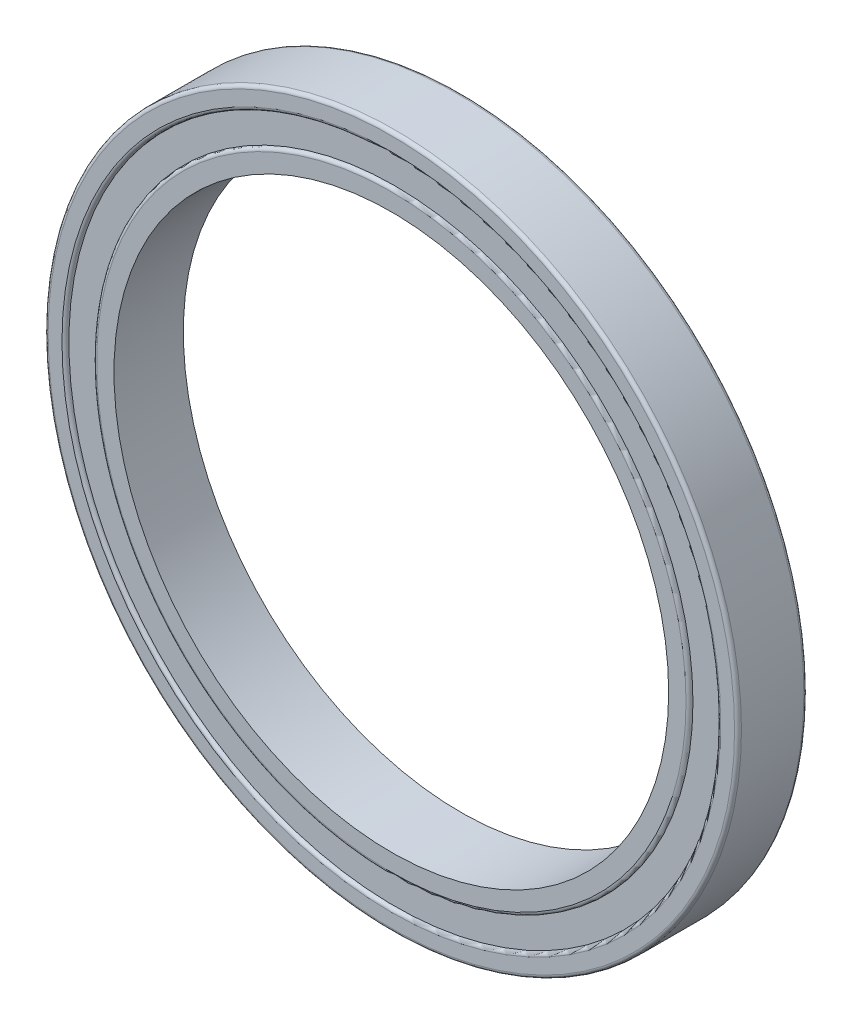
ISO-10303-21;
HEADER;
FILE_DESCRIPTION(('STEP AP214'),'2;1');
FILE_NAME('part.step','',(''),(''),'','','');
FILE_SCHEMA(('AUTOMOTIVE_DESIGN { 1 0 10303 214 1 1 1 1 }'));
ENDSEC;
DATA;
#1=APPLICATION_CONTEXT('core data for automotive mechanical design processes');
#2=APPLICATION_PROTOCOL_DEFINITION('international standard','automotive_design',2000,#1);
#3=PRODUCT_CONTEXT('',#1,'mechanical');
#4=PRODUCT('Part','Part','',(#3));
#5=PRODUCT_RELATED_PRODUCT_CATEGORY('part','',(#4));
#6=PRODUCT_DEFINITION_FORMATION('','',#4);
#7=PRODUCT_DEFINITION_CONTEXT('part definition',#1,'design');
#8=PRODUCT_DEFINITION('design','',#6,#7);
#9=PRODUCT_DEFINITION_SHAPE('','',#8);
#10=(LENGTH_UNIT() NAMED_UNIT(*) SI_UNIT(.MILLI.,.METRE.));
#11=(NAMED_UNIT(*) PLANE_ANGLE_UNIT() SI_UNIT($,.RADIAN.));
#12=(NAMED_UNIT(*) SI_UNIT($,.STERADIAN.) SOLID_ANGLE_UNIT());
#13=UNCERTAINTY_MEASURE_WITH_UNIT(LENGTH_MEASURE(1.E-05),#10,'distance_accuracy_value','');
#14=(GEOMETRIC_REPRESENTATION_CONTEXT(3) GLOBAL_UNCERTAINTY_ASSIGNED_CONTEXT((#13)) GLOBAL_UNIT_ASSIGNED_CONTEXT((#10,
#11,#12)) REPRESENTATION_CONTEXT('',''));
#15=CARTESIAN_POINT('',(0.,0.,0.));
#16=DIRECTION('',(0.,0.,1.));
#17=DIRECTION('',(1.,0.,0.));
#18=AXIS2_PLACEMENT_3D('',#15,#16,#17);
#19=CARTESIAN_POINT('',(0.,0.,0.));
#20=DIRECTION('',(0.,0.,1.));
#21=DIRECTION('',(1.,0.,0.));
#22=AXIS2_PLACEMENT_3D('',#19,#20,#21);
#23=PLANE('',#22);
#24=CARTESIAN_POINT('',(0.,0.,0.));
#25=DIRECTION('',(0.,0.,1.));
#26=DIRECTION('',(1.,0.,0.));
#27=AXIS2_PLACEMENT_3D('',#24,#25,#26);
#28=CIRCLE('',#27,42.5);
#29=CARTESIAN_POINT('',(42.5,0.,0.));
#30=VERTEX_POINT('',#29);
#31=EDGE_CURVE('E70',#30,#30,#28,.F.);
#32=ORIENTED_EDGE('',*,*,#31,.T.);
#33=EDGE_LOOP('',(#32));
#34=FACE_BOUND('',#33,.T.);
#35=CARTESIAN_POINT('',(0.,0.,0.));
#36=DIRECTION('',(0.,0.,1.));
#37=DIRECTION('',(1.,0.,0.));
#38=AXIS2_PLACEMENT_3D('',#35,#36,#37);
#39=CIRCLE('',#38,40.);
#40=CARTESIAN_POINT('',(40.,0.,0.));
#41=VERTEX_POINT('',#40);
#42=EDGE_CURVE('E74',#41,#41,#39,.T.);
#43=ORIENTED_EDGE('',*,*,#42,.T.);
#44=EDGE_LOOP('',(#43));
#45=FACE_BOUND('',#44,.T.);
#46=ADVANCED_FACE('F41',(#34,#45),#23,.F.);
#47=CARTESIAN_POINT('',(0.,0.,10.));
#48=DIRECTION('',(0.,0.,1.));
#49=DIRECTION('',(1.,0.,0.));
#50=AXIS2_PLACEMENT_3D('',#47,#48,#49);
#51=PLANE('',#50);
#52=CARTESIAN_POINT('',(0.,0.,10.));
#53=DIRECTION('',(0.,0.,1.));
#54=DIRECTION('',(1.,0.,0.));
#55=AXIS2_PLACEMENT_3D('',#52,#53,#54);
#56=CIRCLE('',#55,42.5);
#57=CARTESIAN_POINT('',(42.5,0.,10.));
#58=VERTEX_POINT('',#57);
#59=EDGE_CURVE('E61',#58,#58,#56,.T.);
#60=ORIENTED_EDGE('',*,*,#59,.T.);
#61=EDGE_LOOP('',(#60));
#62=FACE_BOUND('',#61,.T.);
#63=CARTESIAN_POINT('',(0.,0.,10.));
#64=DIRECTION('',(0.,0.,1.));
#65=DIRECTION('',(1.,0.,0.));
#66=AXIS2_PLACEMENT_3D('',#63,#64,#65);
#67=CIRCLE('',#66,40.);
#68=CARTESIAN_POINT('',(40.,0.,10.));
#69=VERTEX_POINT('',#68);
#70=EDGE_CURVE('E73',#69,#69,#67,.T.);
#71=ORIENTED_EDGE('',*,*,#70,.F.);
#72=EDGE_LOOP('',(#71));
#73=FACE_BOUND('',#72,.T.);
#74=ADVANCED_FACE('F117',(#62,#73),#51,.T.);
#75=CARTESIAN_POINT('',(0.,0.,10.));
#76=DIRECTION('',(0.,0.,1.));
#77=DIRECTION('',(1.,0.,0.));
#78=AXIS2_PLACEMENT_3D('',#75,#76,#77);
#79=CIRCLE('',#78,47.5);
#80=CARTESIAN_POINT('',(47.5,0.,10.));
#81=VERTEX_POINT('',#80);
#82=EDGE_CURVE('E52',#81,#81,#79,.F.);
#83=ORIENTED_EDGE('',*,*,#82,.T.);
#84=EDGE_LOOP('',(#83));
#85=FACE_BOUND('',#84,.T.);
#86=CARTESIAN_POINT('',(0.,0.,10.));
#87=DIRECTION('',(0.,0.,1.));
#88=DIRECTION('',(1.,0.,0.));
#89=AXIS2_PLACEMENT_3D('',#86,#87,#88);
#90=CIRCLE('',#89,49.5);
#91=CARTESIAN_POINT('',(49.5,0.,10.));
#92=VERTEX_POINT('',#91);
#93=EDGE_CURVE('E56',#92,#92,#90,.T.);
#94=ORIENTED_EDGE('',*,*,#93,.T.);
#95=EDGE_LOOP('',(#94));
#96=FACE_BOUND('',#95,.T.);
#97=ADVANCED_FACE('F124',(#85,#96),#51,.T.);
#98=CARTESIAN_POINT('',(0.,0.,0.));
#99=DIRECTION('',(0.,0.,1.));
#100=DIRECTION('',(1.,0.,0.));
#101=AXIS2_PLACEMENT_3D('',#98,#99,#100);
#102=CIRCLE('',#101,47.5);
#103=CARTESIAN_POINT('',(47.5,0.,0.));
#104=VERTEX_POINT('',#103);
#105=EDGE_CURVE('E64',#104,#104,#102,.T.);
#106=ORIENTED_EDGE('',*,*,#105,.T.);
#107=EDGE_LOOP('',(#106));
#108=FACE_BOUND('',#107,.T.);
#109=CARTESIAN_POINT('',(0.,0.,0.));
#110=DIRECTION('',(0.,0.,1.));
#111=DIRECTION('',(1.,0.,0.));
#112=AXIS2_PLACEMENT_3D('',#109,#110,#111);
#113=CIRCLE('',#112,49.5);
#114=CARTESIAN_POINT('',(49.5,0.,0.));
#115=VERTEX_POINT('',#114);
#116=EDGE_CURVE('E67',#115,#115,#113,.F.);
#117=ORIENTED_EDGE('',*,*,#116,.T.);
#118=EDGE_LOOP('',(#117));
#119=FACE_BOUND('',#118,.T.);
#120=ADVANCED_FACE('F120',(#108,#119),#23,.F.);
#121=CARTESIAN_POINT('',(0.,0.,10.));
#122=DIRECTION('',(0.,0.,-1.));
#123=DIRECTION('',(-1.,0.,0.));
#124=AXIS2_PLACEMENT_3D('',#121,#122,#123);
#125=CYLINDRICAL_SURFACE('',#124,50.);
#126=CARTESIAN_POINT('',(0.,0.,0.5));
#127=DIRECTION('',(0.,0.,1.));
#128=DIRECTION('',(1.,0.,0.));
#129=AXIS2_PLACEMENT_3D('',#126,#127,#128);
#130=CIRCLE('',#129,50.);
#131=CARTESIAN_POINT('',(50.,0.,0.5));
#132=VERTEX_POINT('',#131);
#133=EDGE_CURVE('E10',#132,#132,#130,.T.);
#134=ORIENTED_EDGE('',*,*,#133,.T.);
#135=EDGE_LOOP('',(#134));
#136=FACE_BOUND('',#135,.T.);
#137=CARTESIAN_POINT('',(0.,0.,9.5));
#138=DIRECTION('',(0.,0.,1.));
#139=DIRECTION('',(1.,0.,0.));
#140=AXIS2_PLACEMENT_3D('',#137,#138,#139);
#141=CIRCLE('',#140,50.);
#142=CARTESIAN_POINT('',(50.,0.,9.5));
#143=VERTEX_POINT('',#142);
#144=EDGE_CURVE('E48',#143,#143,#141,.F.);
#145=ORIENTED_EDGE('',*,*,#144,.T.);
#146=EDGE_LOOP('',(#145));
#147=FACE_BOUND('',#146,.T.);
#148=ADVANCED_FACE('F130',(#136,#147),#125,.T.);
#149=CARTESIAN_POINT('',(0.,0.,10.));
#150=DIRECTION('',(0.,0.,-1.));
#151=DIRECTION('',(-1.,0.,0.));
#152=AXIS2_PLACEMENT_3D('',#149,#150,#151);
#153=CYLINDRICAL_SURFACE('',#152,40.);
#154=ORIENTED_EDGE('',*,*,#70,.T.);
#155=EDGE_LOOP('',(#154));
#156=FACE_BOUND('',#155,.T.);
#157=ORIENTED_EDGE('',*,*,#42,.F.);
#158=EDGE_LOOP('',(#157));
#159=FACE_BOUND('',#158,.T.);
#160=ADVANCED_FACE('F136',(#156,#159),#153,.F.);
#161=CARTESIAN_POINT('',(0.,0.,9.5));
#162=DIRECTION('',(0.,0.,1.));
#163=DIRECTION('',(1.,0.,0.));
#164=AXIS2_PLACEMENT_3D('',#161,#162,#163);
#165=PLANE('',#164);
#166=CARTESIAN_POINT('',(0.,0.,9.5));
#167=DIRECTION('',(0.,0.,1.));
#168=DIRECTION('',(1.,0.,0.));
#169=AXIS2_PLACEMENT_3D('',#166,#167,#168);
#170=CIRCLE('',#169,43.);
#171=CARTESIAN_POINT('',(43.,0.,9.5));
#172=VERTEX_POINT('',#171);
#173=EDGE_CURVE('E82',#172,#172,#170,.T.);
#174=ORIENTED_EDGE('',*,*,#173,.F.);
#175=EDGE_LOOP('',(#174));
#176=FACE_BOUND('',#175,.T.);
#177=CARTESIAN_POINT('',(0.,0.,9.5));
#178=DIRECTION('',(0.,0.,1.));
#179=DIRECTION('',(1.,0.,0.));
#180=AXIS2_PLACEMENT_3D('',#177,#178,#179);
#181=CIRCLE('',#180,47.);
#182=CARTESIAN_POINT('',(47.,0.,9.5));
#183=VERTEX_POINT('',#182);
#184=EDGE_CURVE('E77',#183,#183,#181,.T.);
#185=ORIENTED_EDGE('',*,*,#184,.T.);
#186=EDGE_LOOP('',(#185));
#187=FACE_BOUND('',#186,.T.);
#188=ADVANCED_FACE('F98',(#176,#187),#165,.T.);
#189=CARTESIAN_POINT('',(0.,0.,0.5));
#190=DIRECTION('',(0.,0.,-1.));
#191=DIRECTION('',(-1.,0.,0.));
#192=AXIS2_PLACEMENT_3D('',#189,#190,#191);
#193=PLANE('',#192);
#194=CARTESIAN_POINT('',(0.,0.,0.5));
#195=DIRECTION('',(0.,0.,-1.));
#196=DIRECTION('',(-1.,0.,0.));
#197=AXIS2_PLACEMENT_3D('',#194,#195,#196);
#198=CIRCLE('',#197,43.);
#199=CARTESIAN_POINT('',(-43.,0.,0.5));
#200=VERTEX_POINT('',#199);
#201=EDGE_CURVE('E88',#200,#200,#198,.T.);
#202=ORIENTED_EDGE('',*,*,#201,.F.);
#203=EDGE_LOOP('',(#202));
#204=FACE_BOUND('',#203,.T.);
#205=CARTESIAN_POINT('',(0.,0.,0.5));
#206=DIRECTION('',(0.,0.,-1.));
#207=DIRECTION('',(-1.,0.,0.));
#208=AXIS2_PLACEMENT_3D('',#205,#206,#207);
#209=CIRCLE('',#208,47.);
#210=CARTESIAN_POINT('',(-47.,0.,0.5));
#211=VERTEX_POINT('',#210);
#212=EDGE_CURVE('E85',#211,#211,#209,.T.);
#213=ORIENTED_EDGE('',*,*,#212,.T.);
#214=EDGE_LOOP('',(#213));
#215=FACE_BOUND('',#214,.T.);
#216=ADVANCED_FACE('F95',(#204,#215),#193,.T.);
#217=CARTESIAN_POINT('',(0.,0.,0.5));
#218=DIRECTION('',(0.,0.,1.));
#219=DIRECTION('',(1.,0.,0.));
#220=AXIS2_PLACEMENT_3D('',#217,#218,#219);
#221=TOROIDAL_SURFACE('',#220,42.5,0.5);
#222=ORIENTED_EDGE('',*,*,#201,.T.);
#223=EDGE_LOOP('',(#222));
#224=FACE_BOUND('',#223,.T.);
#225=ORIENTED_EDGE('',*,*,#31,.F.);
#226=EDGE_LOOP('',(#225));
#227=FACE_BOUND('',#226,.T.);
#228=ADVANCED_FACE('F92',(#224,#227),#221,.T.);
#229=CARTESIAN_POINT('',(0.,0.,0.5));
#230=DIRECTION('',(0.,0.,1.));
#231=DIRECTION('',(1.,0.,0.));
#232=AXIS2_PLACEMENT_3D('',#229,#230,#231);
#233=TOROIDAL_SURFACE('',#232,47.5,0.5);
#234=ORIENTED_EDGE('',*,*,#105,.F.);
#235=EDGE_LOOP('',(#234));
#236=FACE_BOUND('',#235,.T.);
#237=ORIENTED_EDGE('',*,*,#212,.F.);
#238=EDGE_LOOP('',(#237));
#239=FACE_BOUND('',#238,.T.);
#240=ADVANCED_FACE('F102',(#236,#239),#233,.T.);
#241=CARTESIAN_POINT('',(0.,0.,9.5));
#242=DIRECTION('',(0.,0.,1.));
#243=DIRECTION('',(1.,0.,0.));
#244=AXIS2_PLACEMENT_3D('',#241,#242,#243);
#245=TOROIDAL_SURFACE('',#244,42.5,0.5);
#246=ORIENTED_EDGE('',*,*,#173,.T.);
#247=EDGE_LOOP('',(#246));
#248=FACE_BOUND('',#247,.T.);
#249=ORIENTED_EDGE('',*,*,#59,.F.);
#250=EDGE_LOOP('',(#249));
#251=FACE_BOUND('',#250,.T.);
#252=ADVANCED_FACE('F104',(#248,#251),#245,.T.);
#253=CARTESIAN_POINT('',(0.,0.,9.5));
#254=DIRECTION('',(0.,0.,1.));
#255=DIRECTION('',(1.,0.,0.));
#256=AXIS2_PLACEMENT_3D('',#253,#254,#255);
#257=TOROIDAL_SURFACE('',#256,47.5,0.5);
#258=ORIENTED_EDGE('',*,*,#82,.F.);
#259=EDGE_LOOP('',(#258));
#260=FACE_BOUND('',#259,.T.);
#261=ORIENTED_EDGE('',*,*,#184,.F.);
#262=EDGE_LOOP('',(#261));
#263=FACE_BOUND('',#262,.T.);
#264=ADVANCED_FACE('F111',(#260,#263),#257,.T.);
#265=CARTESIAN_POINT('',(0.,0.,0.5));
#266=DIRECTION('',(0.,0.,1.));
#267=DIRECTION('',(1.,0.,0.));
#268=AXIS2_PLACEMENT_3D('',#265,#266,#267);
#269=TOROIDAL_SURFACE('',#268,49.5,0.5);
#270=ORIENTED_EDGE('',*,*,#116,.F.);
#271=EDGE_LOOP('',(#270));
#272=FACE_BOUND('',#271,.T.);
#273=ORIENTED_EDGE('',*,*,#133,.F.);
#274=EDGE_LOOP('',(#273));
#275=FACE_BOUND('',#274,.T.);
#276=ADVANCED_FACE('F141',(#272,#275),#269,.T.);
#277=CARTESIAN_POINT('',(0.,0.,9.5));
#278=DIRECTION('',(0.,0.,1.));
#279=DIRECTION('',(1.,0.,0.));
#280=AXIS2_PLACEMENT_3D('',#277,#278,#279);
#281=TOROIDAL_SURFACE('',#280,49.5,0.5);
#282=ORIENTED_EDGE('',*,*,#144,.F.);
#283=EDGE_LOOP('',(#282));
#284=FACE_BOUND('',#283,.T.);
#285=ORIENTED_EDGE('',*,*,#93,.F.);
#286=EDGE_LOOP('',(#285));
#287=FACE_BOUND('',#286,.T.);
#288=ADVANCED_FACE('F43',(#284,#287),#281,.T.);
#289=CLOSED_SHELL('',(#46,#74,#97,#120,#148,#160,#188,#216,#228,#240,#252,#264,#276,#288));
#290=MANIFOLD_SOLID_BREP('B2',#289);
#291=ADVANCED_BREP_SHAPE_REPRESENTATION('',(#18,#290),#14);
#292=SHAPE_DEFINITION_REPRESENTATION(#9,#291);
ENDSEC;
END-ISO-10303-21;
